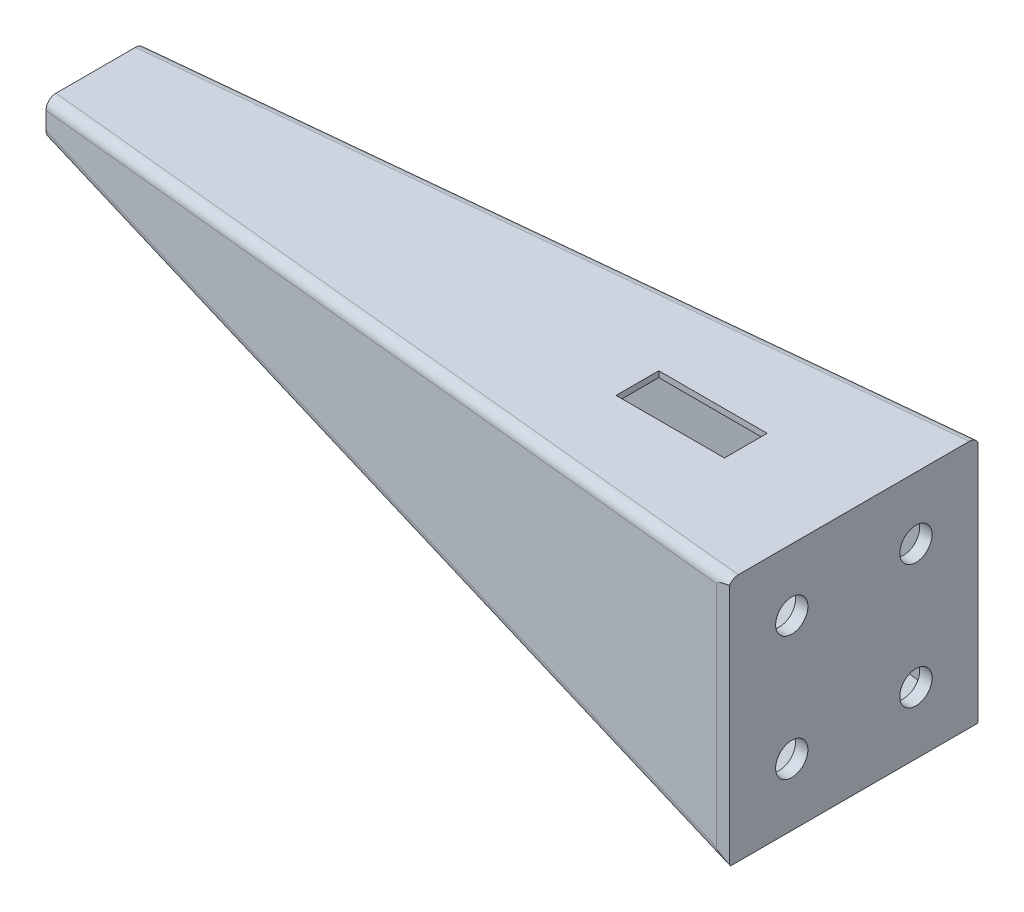
ISO-10303-21;
HEADER;
FILE_DESCRIPTION(('STEP AP214'),'2;1');
FILE_NAME('part.step','',(''),(''),'','','');
FILE_SCHEMA(('AUTOMOTIVE_DESIGN { 1 0 10303 214 1 1 1 1 }'));
ENDSEC;
DATA;
#1=APPLICATION_CONTEXT('core data for automotive mechanical design processes');
#2=APPLICATION_PROTOCOL_DEFINITION('international standard','automotive_design',2000,#1);
#3=PRODUCT_CONTEXT('',#1,'mechanical');
#4=PRODUCT('Part','Part','',(#3));
#5=PRODUCT_RELATED_PRODUCT_CATEGORY('part','',(#4));
#6=PRODUCT_DEFINITION_FORMATION('','',#4);
#7=PRODUCT_DEFINITION_CONTEXT('part definition',#1,'design');
#8=PRODUCT_DEFINITION('design','',#6,#7);
#9=PRODUCT_DEFINITION_SHAPE('','',#8);
#10=(LENGTH_UNIT() NAMED_UNIT(*) SI_UNIT(.MILLI.,.METRE.));
#11=(NAMED_UNIT(*) PLANE_ANGLE_UNIT() SI_UNIT($,.RADIAN.));
#12=(NAMED_UNIT(*) SI_UNIT($,.STERADIAN.) SOLID_ANGLE_UNIT());
#13=UNCERTAINTY_MEASURE_WITH_UNIT(LENGTH_MEASURE(1.E-05),#10,'distance_accuracy_value','');
#14=(GEOMETRIC_REPRESENTATION_CONTEXT(3) GLOBAL_UNCERTAINTY_ASSIGNED_CONTEXT((#13)) GLOBAL_UNIT_ASSIGNED_CONTEXT((#10,
#11,#12)) REPRESENTATION_CONTEXT('',''));
#15=CARTESIAN_POINT('',(0.,0.,0.));
#16=DIRECTION('',(0.,0.,1.));
#17=DIRECTION('',(1.,0.,0.));
#18=AXIS2_PLACEMENT_3D('',#15,#16,#17);
#19=CARTESIAN_POINT('',(-119.833281366305,72.8618846264959,23.8));
#20=DIRECTION('',(-1.,0.,0.));
#21=DIRECTION('',(0.,0.,1.));
#22=AXIS2_PLACEMENT_3D('',#19,#20,#21);
#23=PLANE('',#22);
#24=CARTESIAN_POINT('',(-119.833281366305,-12.5,-12.5));
#25=DIRECTION('',(1.,0.,0.));
#26=DIRECTION('',(0.,0.,-1.));
#27=AXIS2_PLACEMENT_3D('',#24,#25,#26);
#28=CIRCLE('',#27,3.25);
#29=CARTESIAN_POINT('',(-119.833281366305,-12.5,-15.75));
#30=VERTEX_POINT('',#29);
#31=EDGE_CURVE('E398',#30,#30,#28,.T.);
#32=ORIENTED_EDGE('',*,*,#31,.T.);
#33=EDGE_LOOP('',(#32));
#34=FACE_BOUND('',#33,.T.);
#35=CARTESIAN_POINT('',(-119.833281366305,12.5,-12.5));
#36=DIRECTION('',(-1.,0.,0.));
#37=DIRECTION('',(0.,0.,1.));
#38=AXIS2_PLACEMENT_3D('',#35,#36,#37);
#39=CIRCLE('',#38,3.25);
#40=CARTESIAN_POINT('',(-119.833281366305,12.5,-9.25));
#41=VERTEX_POINT('',#40);
#42=EDGE_CURVE('E410',#41,#41,#39,.T.);
#43=ORIENTED_EDGE('',*,*,#42,.F.);
#44=EDGE_LOOP('',(#43));
#45=FACE_BOUND('',#44,.T.);
#46=DIRECTION('',(0.,0.,1.));
#47=VECTOR('',#46,1.);
#48=CARTESIAN_POINT('',(-119.833281366305,23.8,-25.));
#49=LINE('',#48,#47);
#50=CARTESIAN_POINT('',(-119.833281366305,23.8,-23.8));
#51=VERTEX_POINT('',#50);
#52=CARTESIAN_POINT('',(-119.833281366305,23.8,23.8));
#53=VERTEX_POINT('',#52);
#54=EDGE_CURVE('E209',#51,#53,#49,.T.);
#55=ORIENTED_EDGE('',*,*,#54,.F.);
#56=DIRECTION('',(0.,-1.,0.));
#57=VECTOR('',#56,1.);
#58=CARTESIAN_POINT('',(-119.833281366305,72.8618846264959,-23.8));
#59=LINE('',#58,#57);
#60=CARTESIAN_POINT('',(-119.833281366305,-23.8,-23.8));
#61=VERTEX_POINT('',#60);
#62=EDGE_CURVE('E193',#51,#61,#59,.T.);
#63=ORIENTED_EDGE('',*,*,#62,.T.);
#64=DIRECTION('',(0.,0.,-1.));
#65=VECTOR('',#64,1.);
#66=CARTESIAN_POINT('',(-119.833281366305,-23.8,0.));
#67=LINE('',#66,#65);
#68=CARTESIAN_POINT('',(-119.833281366305,-23.8,23.8));
#69=VERTEX_POINT('',#68);
#70=EDGE_CURVE('E189',#69,#61,#67,.T.);
#71=ORIENTED_EDGE('',*,*,#70,.F.);
#72=DIRECTION('',(0.,-1.,0.));
#73=VECTOR('',#72,1.);
#74=CARTESIAN_POINT('',(-119.833281366305,72.8618846264959,23.8));
#75=LINE('',#74,#73);
#76=EDGE_CURVE('E194',#53,#69,#75,.T.);
#77=ORIENTED_EDGE('',*,*,#76,.F.);
#78=EDGE_LOOP('',(#55,#63,#71,#77));
#79=FACE_BOUND('',#78,.T.);
#80=CARTESIAN_POINT('',(-119.833281366305,-12.5,12.5));
#81=DIRECTION('',(-1.,0.,0.));
#82=DIRECTION('',(0.,0.,1.));
#83=AXIS2_PLACEMENT_3D('',#80,#81,#82);
#84=CIRCLE('',#83,3.25);
#85=CARTESIAN_POINT('',(-119.833281366305,-12.5,15.75));
#86=VERTEX_POINT('',#85);
#87=EDGE_CURVE('E413',#86,#86,#84,.T.);
#88=ORIENTED_EDGE('',*,*,#87,.F.);
#89=EDGE_LOOP('',(#88));
#90=FACE_BOUND('',#89,.T.);
#91=CARTESIAN_POINT('',(-119.833281366305,12.5,12.5));
#92=DIRECTION('',(1.,0.,0.));
#93=DIRECTION('',(0.,0.,-1.));
#94=AXIS2_PLACEMENT_3D('',#91,#92,#93);
#95=CIRCLE('',#94,3.25);
#96=CARTESIAN_POINT('',(-119.833281366305,12.5,9.24999999999999));
#97=VERTEX_POINT('',#96);
#98=EDGE_CURVE('E423',#97,#97,#95,.T.);
#99=ORIENTED_EDGE('',*,*,#98,.T.);
#100=EDGE_LOOP('',(#99));
#101=FACE_BOUND('',#100,.T.);
#102=ADVANCED_FACE('F43',(#34,#45,#79,#90,#101),#23,.T.);
#103=CARTESIAN_POINT('',(-117.333281366305,0.,0.));
#104=DIRECTION('',(-1.,0.,0.));
#105=DIRECTION('',(0.,0.,1.));
#106=AXIS2_PLACEMENT_3D('',#103,#104,#105);
#107=PLANE('',#106);
#108=CARTESIAN_POINT('',(-117.333281366305,-12.5,-12.5));
#109=DIRECTION('',(1.,0.,0.));
#110=DIRECTION('',(0.,0.,-1.));
#111=AXIS2_PLACEMENT_3D('',#108,#109,#110);
#112=CIRCLE('',#111,3.25);
#113=CARTESIAN_POINT('',(-117.333281366305,-12.5,-15.75));
#114=VERTEX_POINT('',#113);
#115=EDGE_CURVE('E401',#114,#114,#112,.T.);
#116=ORIENTED_EDGE('',*,*,#115,.F.);
#117=EDGE_LOOP('',(#116));
#118=FACE_BOUND('',#117,.T.);
#119=CARTESIAN_POINT('',(-117.333281366305,12.5,-12.5));
#120=DIRECTION('',(-1.,0.,0.));
#121=DIRECTION('',(0.,0.,1.));
#122=AXIS2_PLACEMENT_3D('',#119,#120,#121);
#123=CIRCLE('',#122,3.25);
#124=CARTESIAN_POINT('',(-117.333281366305,12.5,-9.25));
#125=VERTEX_POINT('',#124);
#126=EDGE_CURVE('E403',#125,#125,#123,.T.);
#127=ORIENTED_EDGE('',*,*,#126,.T.);
#128=EDGE_LOOP('',(#127));
#129=FACE_BOUND('',#128,.T.);
#130=DIRECTION('',(0.,1.,0.));
#131=VECTOR('',#130,1.);
#132=CARTESIAN_POINT('',(-117.333281366305,-25.,-25.));
#133=LINE('',#132,#131);
#134=CARTESIAN_POINT('',(-117.333281366305,-24.7600338851738,-25.));
#135=VERTEX_POINT('',#134);
#136=CARTESIAN_POINT('',(-117.333281366305,23.9954817435175,-25.));
#137=VERTEX_POINT('',#136);
#138=EDGE_CURVE('E504',#135,#137,#133,.T.);
#139=ORIENTED_EDGE('',*,*,#138,.T.);
#140=CARTESIAN_POINT('',(-117.333281366305,23.,-23.2566967391453));
#141=DIRECTION('',(-1.,0.,0.));
#142=DIRECTION('',(0.,0.,-1.));
#143=AXIS2_PLACEMENT_3D('',#140,#141,#142);
#144=ELLIPSE('',#143,2.00997512422418,2.);
#145=CARTESIAN_POINT('',(-117.333281366305,25.,-23.2566967391453));
#146=VERTEX_POINT('',#145);
#147=EDGE_CURVE('E514',#137,#146,#144,.F.);
#148=ORIENTED_EDGE('',*,*,#147,.T.);
#149=DIRECTION('',(0.,0.,1.));
#150=VECTOR('',#149,1.);
#151=CARTESIAN_POINT('',(-117.333281366305,25.,-25.));
#152=LINE('',#151,#150);
#153=CARTESIAN_POINT('',(-117.333281366305,25.,23.2566967391453));
#154=VERTEX_POINT('',#153);
#155=EDGE_CURVE('E517',#146,#154,#152,.T.);
#156=ORIENTED_EDGE('',*,*,#155,.T.);
#157=CARTESIAN_POINT('',(-117.333281366305,23.,23.2566967391453));
#158=DIRECTION('',(-1.,0.,0.));
#159=DIRECTION('',(0.,0.,1.));
#160=AXIS2_PLACEMENT_3D('',#157,#158,#159);
#161=ELLIPSE('',#160,2.00997512422418,2.);
#162=CARTESIAN_POINT('',(-117.333281366305,23.9954817435175,25.));
#163=VERTEX_POINT('',#162);
#164=EDGE_CURVE('E530',#154,#163,#161,.F.);
#165=ORIENTED_EDGE('',*,*,#164,.T.);
#166=DIRECTION('',(0.,-1.,0.));
#167=VECTOR('',#166,1.);
#168=CARTESIAN_POINT('',(-117.333281366305,-25.,25.));
#169=LINE('',#168,#167);
#170=CARTESIAN_POINT('',(-117.333281366305,-24.7600338851739,25.));
#171=VERTEX_POINT('',#170);
#172=EDGE_CURVE('E297',#163,#171,#169,.T.);
#173=ORIENTED_EDGE('',*,*,#172,.T.);
#174=CARTESIAN_POINT('',(-117.333281366305,-23.6768420358577,23.2566967391453));
#175=DIRECTION('',(-1.,0.,0.));
#176=DIRECTION('',(0.,0.942990333582889,-0.332820117735138));
#177=AXIS2_PLACEMENT_3D('',#174,#175,#176);
#178=ELLIPSE('',#177,2.08832734769028,2.);
#179=CARTESIAN_POINT('',(-117.333281366305,-25.,24.8410390213746));
#180=VERTEX_POINT('',#179);
#181=EDGE_CURVE('E535',#171,#180,#178,.F.);
#182=ORIENTED_EDGE('',*,*,#181,.T.);
#183=DIRECTION('',(0.,0.,-1.));
#184=VECTOR('',#183,1.);
#185=CARTESIAN_POINT('',(-117.333281366305,-25.,-25.));
#186=LINE('',#185,#184);
#187=CARTESIAN_POINT('',(-117.333281366305,-25.,-24.8410390213746));
#188=VERTEX_POINT('',#187);
#189=EDGE_CURVE('E518',#180,#188,#186,.T.);
#190=ORIENTED_EDGE('',*,*,#189,.T.);
#191=CARTESIAN_POINT('',(-117.333281366305,-23.6768420358577,-23.2566967391453));
#192=DIRECTION('',(-1.,0.,0.));
#193=DIRECTION('',(0.,0.942990333582889,0.332820117735138));
#194=AXIS2_PLACEMENT_3D('',#191,#192,#193);
#195=ELLIPSE('',#194,2.08832734769028,2.);
#196=EDGE_CURVE('E516',#188,#135,#195,.F.);
#197=ORIENTED_EDGE('',*,*,#196,.T.);
#198=EDGE_LOOP('',(#139,#148,#156,#165,#173,#182,#190,#197));
#199=FACE_BOUND('',#198,.T.);
#200=CARTESIAN_POINT('',(-117.333281366305,-12.5,12.5));
#201=DIRECTION('',(-1.,0.,0.));
#202=DIRECTION('',(0.,0.,1.));
#203=AXIS2_PLACEMENT_3D('',#200,#201,#202);
#204=CIRCLE('',#203,3.25);
#205=CARTESIAN_POINT('',(-117.333281366305,-12.5,15.75));
#206=VERTEX_POINT('',#205);
#207=EDGE_CURVE('E407',#206,#206,#204,.T.);
#208=ORIENTED_EDGE('',*,*,#207,.T.);
#209=EDGE_LOOP('',(#208));
#210=FACE_BOUND('',#209,.T.);
#211=CARTESIAN_POINT('',(-117.333281366305,12.5,12.5));
#212=DIRECTION('',(1.,0.,0.));
#213=DIRECTION('',(0.,0.,-1.));
#214=AXIS2_PLACEMENT_3D('',#211,#212,#213);
#215=CIRCLE('',#214,3.25);
#216=CARTESIAN_POINT('',(-117.333281366305,12.5,9.24999999999999));
#217=VERTEX_POINT('',#216);
#218=EDGE_CURVE('E420',#217,#217,#215,.T.);
#219=ORIENTED_EDGE('',*,*,#218,.F.);
#220=EDGE_LOOP('',(#219));
#221=FACE_BOUND('',#220,.T.);
#222=ADVANCED_FACE('F272',(#118,#129,#199,#210,#221),#107,.F.);
#223=CARTESIAN_POINT('',(-120.,-25.,-23.8));
#224=DIRECTION('',(0.,0.,-1.));
#225=DIRECTION('',(-1.,0.,0.));
#226=AXIS2_PLACEMENT_3D('',#223,#224,#225);
#227=PLANE('',#226);
#228=ORIENTED_EDGE('',*,*,#62,.F.);
#229=DIRECTION('',(1.,0.,0.));
#230=VECTOR('',#229,1.);
#231=CARTESIAN_POINT('',(-120.,23.8,-23.8));
#232=LINE('',#231,#230);
#233=CARTESIAN_POINT('',(-119.940149254655,23.8,-23.8));
#234=VERTEX_POINT('',#233);
#235=EDGE_CURVE('E217',#234,#51,#232,.T.);
#236=ORIENTED_EDGE('',*,*,#235,.F.);
#237=DIRECTION('',(0.,1.,0.));
#238=VECTOR('',#237,1.);
#239=CARTESIAN_POINT('',(-119.940149254655,0.,-23.8));
#240=LINE('',#239,#238);
#241=CARTESIAN_POINT('',(-119.940149254655,-23.7697207649676,-23.8));
#242=VERTEX_POINT('',#241);
#243=EDGE_CURVE('E196',#242,#234,#240,.T.);
#244=ORIENTED_EDGE('',*,*,#243,.F.);
#245=DIRECTION('',(-0.962126726315384,0.272602572456025,0.));
#246=VECTOR('',#245,1.);
#247=CARTESIAN_POINT('',(-15.1472919297666,-53.4610303403526,-23.8));
#248=LINE('',#247,#246);
#249=EDGE_CURVE('E212',#61,#242,#248,.T.);
#250=ORIENTED_EDGE('',*,*,#249,.F.);
#251=EDGE_LOOP('',(#228,#236,#244,#250));
#252=FACE_BOUND('',#251,.T.);
#253=ADVANCED_FACE('F347',(#252),#227,.F.);
#254=CARTESIAN_POINT('',(-15.1472919297666,-53.4610303403526,0.));
#255=DIRECTION('',(0.272602572456025,0.962126726315384,0.));
#256=DIRECTION('',(-0.962126726315384,0.272602572456025,0.));
#257=AXIS2_PLACEMENT_3D('',#254,#255,#256);
#258=PLANE('',#257);
#259=DIRECTION('',(-0.957704261361147,0.271349540718991,-0.0957704261361147));
#260=VECTOR('',#259,1.);
#261=CARTESIAN_POINT('',(-18.2913792835745,-52.5702055901071,33.964876997108));
#262=LINE('',#261,#260);
#263=CARTESIAN_POINT('',(-119.940149254655,-23.7697207649676,23.8));
#264=VERTEX_POINT('',#263);
#265=CARTESIAN_POINT('',(-268.8,18.4072369462135,8.91401492546549));
#266=VERTEX_POINT('',#265);
#267=EDGE_CURVE('E213',#264,#266,#262,.T.);
#268=ORIENTED_EDGE('',*,*,#267,.F.);
#269=DIRECTION('',(-0.962126726315384,0.272602572456025,0.));
#270=VECTOR('',#269,1.);
#271=CARTESIAN_POINT('',(-119.672876913053,-23.8454479284215,23.8));
#272=LINE('',#271,#270);
#273=EDGE_CURVE('E207',#69,#264,#272,.T.);
#274=ORIENTED_EDGE('',*,*,#273,.F.);
#275=ORIENTED_EDGE('',*,*,#70,.T.);
#276=ORIENTED_EDGE('',*,*,#249,.T.);
#277=DIRECTION('',(-0.957704261361147,0.271349540718991,0.0957704261361146));
#278=VECTOR('',#277,1.);
#279=CARTESIAN_POINT('',(-18.2913792835745,-52.5702055901071,-33.964876997108));
#280=LINE('',#279,#278);
#281=CARTESIAN_POINT('',(-268.8,18.4072369462135,-8.91401492546548));
#282=VERTEX_POINT('',#281);
#283=EDGE_CURVE('E461',#242,#282,#280,.T.);
#284=ORIENTED_EDGE('',*,*,#283,.T.);
#285=DIRECTION('',(0.,0.,1.));
#286=VECTOR('',#285,1.);
#287=CARTESIAN_POINT('',(-268.8,18.4072369462135,0.));
#288=LINE('',#287,#286);
#289=EDGE_CURVE('E477',#282,#266,#288,.T.);
#290=ORIENTED_EDGE('',*,*,#289,.T.);
#291=EDGE_LOOP('',(#268,#274,#275,#276,#284,#290));
#292=FACE_BOUND('',#291,.T.);
#293=ADVANCED_FACE('F211',(#292),#258,.T.);
#294=CARTESIAN_POINT('',(-3.54396187380846,0.,-35.4396187380846));
#295=DIRECTION('',(0.0995037190209989,0.,0.995037190209989));
#296=DIRECTION('',(0.995037190209989,0.,-0.0995037190209989));
#297=AXIS2_PLACEMENT_3D('',#294,#295,#296);
#298=PLANE('',#297);
#299=ORIENTED_EDGE('',*,*,#283,.F.);
#300=ORIENTED_EDGE('',*,*,#243,.T.);
#301=DIRECTION('',(-0.995037190209989,0.,0.0995037190209989));
#302=VECTOR('',#301,1.);
#303=CARTESIAN_POINT('',(-3.54396187380846,23.8,-35.4396187380846));
#304=LINE('',#303,#302);
#305=CARTESIAN_POINT('',(-268.8,23.8,-8.91401492546548));
#306=VERTEX_POINT('',#305);
#307=EDGE_CURVE('E462',#234,#306,#304,.T.);
#308=ORIENTED_EDGE('',*,*,#307,.T.);
#309=DIRECTION('',(0.,-1.,0.));
#310=VECTOR('',#309,1.);
#311=CARTESIAN_POINT('',(-268.8,0.,-8.91401492546549));
#312=LINE('',#311,#310);
#313=EDGE_CURVE('E225',#306,#282,#312,.T.);
#314=ORIENTED_EDGE('',*,*,#313,.T.);
#315=EDGE_LOOP('',(#299,#300,#308,#314));
#316=FACE_BOUND('',#315,.T.);
#317=ADVANCED_FACE('F342',(#316),#298,.T.);
#318=CARTESIAN_POINT('',(-268.8,0.,0.));
#319=DIRECTION('',(1.,0.,0.));
#320=DIRECTION('',(0.,0.,-1.));
#321=AXIS2_PLACEMENT_3D('',#318,#319,#320);
#322=PLANE('',#321);
#323=DIRECTION('',(0.,1.,0.));
#324=VECTOR('',#323,1.);
#325=CARTESIAN_POINT('',(-268.8,0.,8.91401492546549));
#326=LINE('',#325,#324);
#327=CARTESIAN_POINT('',(-268.8,23.8,8.91401492546549));
#328=VERTEX_POINT('',#327);
#329=EDGE_CURVE('E456',#266,#328,#326,.T.);
#330=ORIENTED_EDGE('',*,*,#329,.F.);
#331=ORIENTED_EDGE('',*,*,#289,.F.);
#332=ORIENTED_EDGE('',*,*,#313,.F.);
#333=DIRECTION('',(0.,0.,-1.));
#334=VECTOR('',#333,1.);
#335=CARTESIAN_POINT('',(-268.8,23.8,-25.));
#336=LINE('',#335,#334);
#337=EDGE_CURVE('E463',#328,#306,#336,.T.);
#338=ORIENTED_EDGE('',*,*,#337,.F.);
#339=EDGE_LOOP('',(#330,#331,#332,#338));
#340=FACE_BOUND('',#339,.T.);
#341=ADVANCED_FACE('F344',(#340),#322,.T.);
#342=CARTESIAN_POINT('',(-3.54396187380847,0.,35.4396187380847));
#343=DIRECTION('',(0.0995037190209989,0.,-0.995037190209989));
#344=DIRECTION('',(-0.995037190209989,0.,-0.0995037190209989));
#345=AXIS2_PLACEMENT_3D('',#342,#343,#344);
#346=PLANE('',#345);
#347=DIRECTION('',(-0.995037190209989,0.,-0.0995037190209989));
#348=VECTOR('',#347,1.);
#349=CARTESIAN_POINT('',(-124.83109058668,23.8,23.3109058667975));
#350=LINE('',#349,#348);
#351=CARTESIAN_POINT('',(-119.940149254655,23.8,23.8));
#352=VERTEX_POINT('',#351);
#353=EDGE_CURVE('E466',#352,#328,#350,.T.);
#354=ORIENTED_EDGE('',*,*,#353,.F.);
#355=DIRECTION('',(0.,-1.,0.));
#356=VECTOR('',#355,1.);
#357=CARTESIAN_POINT('',(-119.940149254655,0.,23.8));
#358=LINE('',#357,#356);
#359=EDGE_CURVE('E198',#352,#264,#358,.T.);
#360=ORIENTED_EDGE('',*,*,#359,.T.);
#361=ORIENTED_EDGE('',*,*,#267,.T.);
#362=ORIENTED_EDGE('',*,*,#329,.T.);
#363=EDGE_LOOP('',(#354,#360,#361,#362));
#364=FACE_BOUND('',#363,.T.);
#365=ADVANCED_FACE('F333',(#364),#346,.T.);
#366=CARTESIAN_POINT('',(-120.,-25.,23.8));
#367=DIRECTION('',(0.,0.,1.));
#368=DIRECTION('',(1.,0.,0.));
#369=AXIS2_PLACEMENT_3D('',#366,#367,#368);
#370=PLANE('',#369);
#371=DIRECTION('',(1.,0.,0.));
#372=VECTOR('',#371,1.);
#373=CARTESIAN_POINT('',(-120.,23.8,23.8));
#374=LINE('',#373,#372);
#375=EDGE_CURVE('E206',#352,#53,#374,.T.);
#376=ORIENTED_EDGE('',*,*,#375,.T.);
#377=ORIENTED_EDGE('',*,*,#76,.T.);
#378=ORIENTED_EDGE('',*,*,#273,.T.);
#379=ORIENTED_EDGE('',*,*,#359,.F.);
#380=EDGE_LOOP('',(#376,#377,#378,#379));
#381=FACE_BOUND('',#380,.T.);
#382=ADVANCED_FACE('F203',(#381),#370,.F.);
#383=CARTESIAN_POINT('',(-120.,23.8,-25.));
#384=DIRECTION('',(0.,1.,0.));
#385=DIRECTION('',(0.,0.,1.));
#386=AXIS2_PLACEMENT_3D('',#383,#384,#385);
#387=PLANE('',#386);
#388=DIRECTION('',(-1.,0.,0.));
#389=VECTOR('',#388,1.);
#390=CARTESIAN_POINT('',(-120.,23.8,-4.3));
#391=LINE('',#390,#389);
#392=CARTESIAN_POINT('',(-139.09,23.8,-4.3));
#393=VERTEX_POINT('',#392);
#394=CARTESIAN_POINT('',(-160.91,23.8,-4.3));
#395=VERTEX_POINT('',#394);
#396=EDGE_CURVE('E453',#393,#395,#391,.T.);
#397=ORIENTED_EDGE('',*,*,#396,.T.);
#398=DIRECTION('',(0.,0.,1.));
#399=VECTOR('',#398,1.);
#400=CARTESIAN_POINT('',(-160.91,23.8,-25.));
#401=LINE('',#400,#399);
#402=CARTESIAN_POINT('',(-160.91,23.8,4.3));
#403=VERTEX_POINT('',#402);
#404=EDGE_CURVE('E460',#395,#403,#401,.T.);
#405=ORIENTED_EDGE('',*,*,#404,.T.);
#406=DIRECTION('',(1.,0.,0.));
#407=VECTOR('',#406,1.);
#408=CARTESIAN_POINT('',(-120.,23.8,4.3));
#409=LINE('',#408,#407);
#410=CARTESIAN_POINT('',(-139.09,23.8,4.3));
#411=VERTEX_POINT('',#410);
#412=EDGE_CURVE('E449',#403,#411,#409,.T.);
#413=ORIENTED_EDGE('',*,*,#412,.T.);
#414=DIRECTION('',(0.,0.,-1.));
#415=VECTOR('',#414,1.);
#416=CARTESIAN_POINT('',(-139.09,23.8,-25.));
#417=LINE('',#416,#415);
#418=EDGE_CURVE('E454',#411,#393,#417,.T.);
#419=ORIENTED_EDGE('',*,*,#418,.T.);
#420=EDGE_LOOP('',(#397,#405,#413,#419));
#421=FACE_BOUND('',#420,.T.);
#422=ORIENTED_EDGE('',*,*,#235,.T.);
#423=ORIENTED_EDGE('',*,*,#54,.T.);
#424=ORIENTED_EDGE('',*,*,#375,.F.);
#425=ORIENTED_EDGE('',*,*,#353,.T.);
#426=ORIENTED_EDGE('',*,*,#337,.T.);
#427=ORIENTED_EDGE('',*,*,#307,.F.);
#428=EDGE_LOOP('',(#422,#423,#424,#425,#426,#427));
#429=FACE_BOUND('',#428,.T.);
#430=ADVANCED_FACE('F266',(#421,#429),#387,.F.);
#431=CARTESIAN_POINT('',(-120.,25.,-25.));
#432=DIRECTION('',(0.,1.,0.));
#433=DIRECTION('',(0.,0.,1.));
#434=AXIS2_PLACEMENT_3D('',#431,#432,#433);
#435=PLANE('',#434);
#436=ORIENTED_EDGE('',*,*,#155,.F.);
#437=DIRECTION('',(-0.995037190209989,0.,0.0995037190209989));
#438=VECTOR('',#437,1.);
#439=CARTESIAN_POINT('',(-269.800992561958,25.,-8.00992561958003));
#440=LINE('',#439,#438);
#441=CARTESIAN_POINT('',(-270.,25.,-7.99002487577582));
#442=VERTEX_POINT('',#441);
#443=EDGE_CURVE('E299',#146,#442,#440,.T.);
#444=ORIENTED_EDGE('',*,*,#443,.T.);
#445=DIRECTION('',(0.,0.,-1.));
#446=VECTOR('',#445,1.);
#447=CARTESIAN_POINT('',(-270.,25.,-10.));
#448=LINE('',#447,#446);
#449=CARTESIAN_POINT('',(-270.,25.,7.99002487577583));
#450=VERTEX_POINT('',#449);
#451=EDGE_CURVE('E295',#450,#442,#448,.T.);
#452=ORIENTED_EDGE('',*,*,#451,.F.);
#453=DIRECTION('',(-0.995037190209989,0.,-0.0995037190209989));
#454=VECTOR('',#453,1.);
#455=CARTESIAN_POINT('',(-119.800992561958,25.,23.00992561958));
#456=LINE('',#455,#454);
#457=EDGE_CURVE('E300',#450,#154,#456,.F.);
#458=ORIENTED_EDGE('',*,*,#457,.T.);
#459=EDGE_LOOP('',(#436,#444,#452,#458));
#460=FACE_BOUND('',#459,.T.);
#461=DIRECTION('',(0.,0.,1.));
#462=VECTOR('',#461,1.);
#463=CARTESIAN_POINT('',(-160.91,25.,-4.3));
#464=LINE('',#463,#462);
#465=CARTESIAN_POINT('',(-160.91,25.,-4.3));
#466=VERTEX_POINT('',#465);
#467=CARTESIAN_POINT('',(-160.91,25.,4.3));
#468=VERTEX_POINT('',#467);
#469=EDGE_CURVE('E447',#466,#468,#464,.T.);
#470=ORIENTED_EDGE('',*,*,#469,.F.);
#471=DIRECTION('',(-1.,0.,0.));
#472=VECTOR('',#471,1.);
#473=CARTESIAN_POINT('',(-139.09,25.,-4.3));
#474=LINE('',#473,#472);
#475=CARTESIAN_POINT('',(-139.09,25.,-4.3));
#476=VERTEX_POINT('',#475);
#477=EDGE_CURVE('E435',#476,#466,#474,.T.);
#478=ORIENTED_EDGE('',*,*,#477,.F.);
#479=DIRECTION('',(0.,0.,-1.));
#480=VECTOR('',#479,1.);
#481=CARTESIAN_POINT('',(-139.09,25.,-4.3));
#482=LINE('',#481,#480);
#483=CARTESIAN_POINT('',(-139.09,25.,4.3));
#484=VERTEX_POINT('',#483);
#485=EDGE_CURVE('E439',#484,#476,#482,.T.);
#486=ORIENTED_EDGE('',*,*,#485,.F.);
#487=DIRECTION('',(1.,0.,0.));
#488=VECTOR('',#487,1.);
#489=CARTESIAN_POINT('',(-139.09,25.,4.3));
#490=LINE('',#489,#488);
#491=EDGE_CURVE('E442',#468,#484,#490,.T.);
#492=ORIENTED_EDGE('',*,*,#491,.F.);
#493=EDGE_LOOP('',(#470,#478,#486,#492));
#494=FACE_BOUND('',#493,.T.);
#495=ADVANCED_FACE('F256',(#460,#494),#435,.T.);
#496=CARTESIAN_POINT('',(-120.,-25.,-25.));
#497=DIRECTION('',(0.,0.,-1.));
#498=DIRECTION('',(-1.,0.,0.));
#499=AXIS2_PLACEMENT_3D('',#496,#497,#498);
#500=PLANE('',#499);
#501=DIRECTION('',(0.,1.,0.));
#502=VECTOR('',#501,1.);
#503=CARTESIAN_POINT('',(-120.,-25.,-25.));
#504=LINE('',#503,#502);
#505=CARTESIAN_POINT('',(-120.,-22.9776571970894,-25.));
#506=VERTEX_POINT('',#505);
#507=CARTESIAN_POINT('',(-120.,23.,-25.));
#508=VERTEX_POINT('',#507);
#509=EDGE_CURVE('E553',#506,#508,#504,.T.);
#510=ORIENTED_EDGE('',*,*,#509,.T.);
#511=CARTESIAN_POINT('',(-99.9002487577583,23.,-25.));
#512=DIRECTION('',(0.,0.,-1.));
#513=DIRECTION('',(1.,0.,0.));
#514=AXIS2_PLACEMENT_3D('',#511,#512,#513);
#515=ELLIPSE('',#514,20.0997512422418,2.);
#516=EDGE_CURVE('E527',#508,#137,#515,.T.);
#517=ORIENTED_EDGE('',*,*,#516,.T.);
#518=ORIENTED_EDGE('',*,*,#138,.F.);
#519=CARTESIAN_POINT('',(-99.9002487577582,-28.616201274946,-25.));
#520=DIRECTION('',(0.,0.,-1.));
#521=DIRECTION('',(-0.962126726315384,0.272602572456025,0.));
#522=AXIS2_PLACEMENT_3D('',#519,#520,#521);
#523=ELLIPSE('',#522,20.8832734769028,2.);
#524=EDGE_CURVE('E601',#135,#506,#523,.T.);
#525=ORIENTED_EDGE('',*,*,#524,.T.);
#526=EDGE_LOOP('',(#510,#517,#518,#525));
#527=FACE_BOUND('',#526,.T.);
#528=ADVANCED_FACE('F254',(#527),#500,.T.);
#529=CARTESIAN_POINT('',(-120.,-25.,-25.));
#530=DIRECTION('',(0.,-1.,0.));
#531=DIRECTION('',(0.,0.,-1.));
#532=AXIS2_PLACEMENT_3D('',#529,#530,#531);
#533=PLANE('',#532);
#534=ORIENTED_EDGE('',*,*,#189,.F.);
#535=CARTESIAN_POINT('',(-112.663312081097,-25.,23.7236936676661));
#536=DIRECTION('',(0.,-1.,0.));
#537=DIRECTION('',(-0.995037190209989,0.,-0.0995037190209989));
#538=AXIS2_PLACEMENT_3D('',#535,#536,#537);
#539=ELLIPSE('',#538,7.3705671094951,2.);
#540=CARTESIAN_POINT('',(-120.,-25.,23.044545390267));
#541=VERTEX_POINT('',#540);
#542=EDGE_CURVE('E11',#180,#541,#539,.T.);
#543=ORIENTED_EDGE('',*,*,#542,.T.);
#544=DIRECTION('',(0.,0.,-1.));
#545=VECTOR('',#544,1.);
#546=CARTESIAN_POINT('',(-120.,-25.,-25.));
#547=LINE('',#546,#545);
#548=CARTESIAN_POINT('',(-120.,-25.,-23.044545390267));
#549=VERTEX_POINT('',#548);
#550=EDGE_CURVE('E540',#541,#549,#547,.T.);
#551=ORIENTED_EDGE('',*,*,#550,.T.);
#552=CARTESIAN_POINT('',(-112.663312081097,-25.,-23.7236936676661));
#553=DIRECTION('',(0.,-1.,0.));
#554=DIRECTION('',(-0.995037190209989,0.,0.0995037190209989));
#555=AXIS2_PLACEMENT_3D('',#552,#553,#554);
#556=ELLIPSE('',#555,7.3705671094951,2.);
#557=EDGE_CURVE('E52',#549,#188,#556,.T.);
#558=ORIENTED_EDGE('',*,*,#557,.T.);
#559=EDGE_LOOP('',(#534,#543,#551,#558));
#560=FACE_BOUND('',#559,.T.);
#561=ADVANCED_FACE('F259',(#560),#533,.T.);
#562=CARTESIAN_POINT('',(-120.,-25.,25.));
#563=DIRECTION('',(0.,0.,1.));
#564=DIRECTION('',(1.,0.,0.));
#565=AXIS2_PLACEMENT_3D('',#562,#563,#564);
#566=PLANE('',#565);
#567=ORIENTED_EDGE('',*,*,#172,.F.);
#568=CARTESIAN_POINT('',(-99.9002487577583,23.,25.));
#569=DIRECTION('',(0.,0.,1.));
#570=DIRECTION('',(1.,0.,0.));
#571=AXIS2_PLACEMENT_3D('',#568,#569,#570);
#572=ELLIPSE('',#571,20.0997512422418,2.);
#573=CARTESIAN_POINT('',(-120.,23.,25.));
#574=VERTEX_POINT('',#573);
#575=EDGE_CURVE('E549',#163,#574,#572,.T.);
#576=ORIENTED_EDGE('',*,*,#575,.T.);
#577=DIRECTION('',(0.,-1.,0.));
#578=VECTOR('',#577,1.);
#579=CARTESIAN_POINT('',(-120.,-25.,25.));
#580=LINE('',#579,#578);
#581=CARTESIAN_POINT('',(-120.,-22.9776571970894,25.));
#582=VERTEX_POINT('',#581);
#583=EDGE_CURVE('E539',#574,#582,#580,.T.);
#584=ORIENTED_EDGE('',*,*,#583,.T.);
#585=CARTESIAN_POINT('',(-99.9002487577583,-28.616201274946,25.));
#586=DIRECTION('',(0.,0.,1.));
#587=DIRECTION('',(-0.962126726315384,0.272602572456025,0.));
#588=AXIS2_PLACEMENT_3D('',#585,#586,#587);
#589=ELLIPSE('',#588,20.8832734769028,2.);
#590=EDGE_CURVE('E544',#582,#171,#589,.T.);
#591=ORIENTED_EDGE('',*,*,#590,.T.);
#592=EDGE_LOOP('',(#567,#576,#584,#591));
#593=FACE_BOUND('',#592,.T.);
#594=ADVANCED_FACE('F262',(#593),#566,.T.);
#595=CARTESIAN_POINT('',(-270.,0.,0.));
#596=DIRECTION('',(1.,0.,0.));
#597=DIRECTION('',(0.,0.,-1.));
#598=AXIS2_PLACEMENT_3D('',#595,#596,#597);
#599=PLANE('',#598);
#600=ORIENTED_EDGE('',*,*,#451,.T.);
#601=CARTESIAN_POINT('',(-270.,23.,-7.99002487577583));
#602=DIRECTION('',(1.,0.,0.));
#603=DIRECTION('',(0.,0.,-1.));
#604=AXIS2_PLACEMENT_3D('',#601,#602,#603);
#605=ELLIPSE('',#604,2.00997512422418,2.);
#606=CARTESIAN_POINT('',(-270.,23.,-10.));
#607=VERTEX_POINT('',#606);
#608=EDGE_CURVE('E590',#442,#607,#605,.F.);
#609=ORIENTED_EDGE('',*,*,#608,.T.);
#610=DIRECTION('',(0.,-1.,0.));
#611=VECTOR('',#610,1.);
#612=CARTESIAN_POINT('',(-270.,17.5,-10.));
#613=LINE('',#612,#611);
#614=CARTESIAN_POINT('',(-270.,19.5223428029106,-10.));
#615=VERTEX_POINT('',#614);
#616=EDGE_CURVE('E319',#607,#615,#613,.T.);
#617=ORIENTED_EDGE('',*,*,#616,.T.);
#618=CARTESIAN_POINT('',(-270.,19.5787282436892,-7.99002487577582));
#619=DIRECTION('',(1.,0.,0.));
#620=DIRECTION('',(0.,0.942990333582889,0.332820117735138));
#621=AXIS2_PLACEMENT_3D('',#618,#619,#620);
#622=ELLIPSE('',#621,2.08832734769028,2.);
#623=CARTESIAN_POINT('',(-270.,17.5,-8.04454539026703));
#624=VERTEX_POINT('',#623);
#625=EDGE_CURVE('E302',#615,#624,#622,.F.);
#626=ORIENTED_EDGE('',*,*,#625,.T.);
#627=DIRECTION('',(0.,0.,1.));
#628=VECTOR('',#627,1.);
#629=CARTESIAN_POINT('',(-270.,17.5,-10.));
#630=LINE('',#629,#628);
#631=CARTESIAN_POINT('',(-270.,17.5,8.04454539026703));
#632=VERTEX_POINT('',#631);
#633=EDGE_CURVE('E50',#624,#632,#630,.T.);
#634=ORIENTED_EDGE('',*,*,#633,.T.);
#635=CARTESIAN_POINT('',(-270.,19.5787282436892,7.99002487577583));
#636=DIRECTION('',(1.,0.,0.));
#637=DIRECTION('',(0.,0.942990333582889,-0.332820117735138));
#638=AXIS2_PLACEMENT_3D('',#635,#636,#637);
#639=ELLIPSE('',#638,2.08832734769028,2.);
#640=CARTESIAN_POINT('',(-270.,19.5223428029106,10.));
#641=VERTEX_POINT('',#640);
#642=EDGE_CURVE('E580',#632,#641,#639,.F.);
#643=ORIENTED_EDGE('',*,*,#642,.T.);
#644=DIRECTION('',(0.,1.,0.));
#645=VECTOR('',#644,1.);
#646=CARTESIAN_POINT('',(-270.,17.5,10.));
#647=LINE('',#646,#645);
#648=CARTESIAN_POINT('',(-270.,23.,10.));
#649=VERTEX_POINT('',#648);
#650=EDGE_CURVE('E219',#641,#649,#647,.T.);
#651=ORIENTED_EDGE('',*,*,#650,.T.);
#652=CARTESIAN_POINT('',(-270.,23.,7.99002487577583));
#653=DIRECTION('',(1.,0.,0.));
#654=DIRECTION('',(0.,0.,1.));
#655=AXIS2_PLACEMENT_3D('',#652,#653,#654);
#656=ELLIPSE('',#655,2.00997512422418,2.);
#657=EDGE_CURVE('E585',#649,#450,#656,.F.);
#658=ORIENTED_EDGE('',*,*,#657,.T.);
#659=EDGE_LOOP('',(#600,#609,#617,#626,#634,#643,#651,#658));
#660=FACE_BOUND('',#659,.T.);
#661=ADVANCED_FACE('F261',(#660),#599,.F.);
#662=CARTESIAN_POINT('',(-3.66336633663366,0.,-36.6336633663366));
#663=DIRECTION('',(0.0995037190209989,0.,0.995037190209989));
#664=DIRECTION('',(0.995037190209989,0.,-0.0995037190209989));
#665=AXIS2_PLACEMENT_3D('',#662,#663,#664);
#666=PLANE('',#665);
#667=ORIENTED_EDGE('',*,*,#616,.F.);
#668=DIRECTION('',(-0.995037190209989,0.,0.0995037190209989));
#669=VECTOR('',#668,1.);
#670=CARTESIAN_POINT('',(-120.,23.,-25.));
#671=LINE('',#670,#669);
#672=EDGE_CURVE('E596',#607,#508,#671,.F.);
#673=ORIENTED_EDGE('',*,*,#672,.T.);
#674=ORIENTED_EDGE('',*,*,#509,.F.);
#675=DIRECTION('',(-0.957704261361147,0.271349540718991,0.0957704261361147));
#676=VECTOR('',#675,1.);
#677=CARTESIAN_POINT('',(-18.2005631442118,-51.8208309728961,-35.1799436855788));
#678=LINE('',#677,#676);
#679=EDGE_CURVE('E592',#506,#615,#678,.T.);
#680=ORIENTED_EDGE('',*,*,#679,.T.);
#681=EDGE_LOOP('',(#667,#673,#674,#680));
#682=FACE_BOUND('',#681,.T.);
#683=ADVANCED_FACE('F244',(#682),#666,.F.);
#684=CARTESIAN_POINT('',(-15.4744150167138,-54.6155824119311,0.));
#685=DIRECTION('',(0.272602572456025,0.962126726315384,0.));
#686=DIRECTION('',(-0.962126726315384,0.272602572456025,0.));
#687=AXIS2_PLACEMENT_3D('',#684,#685,#686);
#688=PLANE('',#687);
#689=ORIENTED_EDGE('',*,*,#550,.F.);
#690=DIRECTION('',(-0.957704261361147,0.271349540718992,-0.0957704261361147));
#691=VECTOR('',#690,1.);
#692=CARTESIAN_POINT('',(-18.5467608510818,-53.7450844255268,33.1898693051589));
#693=LINE('',#692,#691);
#694=EDGE_CURVE('E567',#541,#632,#693,.T.);
#695=ORIENTED_EDGE('',*,*,#694,.T.);
#696=ORIENTED_EDGE('',*,*,#633,.F.);
#697=DIRECTION('',(-0.957704261361147,0.271349540718992,0.0957704261361147));
#698=VECTOR('',#697,1.);
#699=CARTESIAN_POINT('',(-18.5467608510818,-53.7450844255268,-33.1898693051588));
#700=LINE('',#699,#698);
#701=EDGE_CURVE('E64',#624,#549,#700,.F.);
#702=ORIENTED_EDGE('',*,*,#701,.T.);
#703=EDGE_LOOP('',(#689,#695,#696,#702));
#704=FACE_BOUND('',#703,.T.);
#705=ADVANCED_FACE('F232',(#704),#688,.F.);
#706=CARTESIAN_POINT('',(-3.66336633663366,0.,36.6336633663366));
#707=DIRECTION('',(0.0995037190209989,0.,-0.995037190209989));
#708=DIRECTION('',(-0.995037190209989,0.,-0.0995037190209989));
#709=AXIS2_PLACEMENT_3D('',#706,#707,#708);
#710=PLANE('',#709);
#711=ORIENTED_EDGE('',*,*,#583,.F.);
#712=DIRECTION('',(-0.995037190209989,0.,-0.0995037190209989));
#713=VECTOR('',#712,1.);
#714=CARTESIAN_POINT('',(-270.,23.,10.));
#715=LINE('',#714,#713);
#716=EDGE_CURVE('E528',#574,#649,#715,.T.);
#717=ORIENTED_EDGE('',*,*,#716,.T.);
#718=ORIENTED_EDGE('',*,*,#650,.F.);
#719=DIRECTION('',(-0.957704261361147,0.271349540718991,-0.0957704261361147));
#720=VECTOR('',#719,1.);
#721=CARTESIAN_POINT('',(-18.2005631442118,-51.8208309728961,35.1799436855788));
#722=LINE('',#721,#720);
#723=EDGE_CURVE('E529',#641,#582,#722,.F.);
#724=ORIENTED_EDGE('',*,*,#723,.T.);
#725=EDGE_LOOP('',(#711,#717,#718,#724));
#726=FACE_BOUND('',#725,.T.);
#727=ADVANCED_FACE('F242',(#726),#710,.F.);
#728=CARTESIAN_POINT('',(-160.91,21.,-4.3));
#729=DIRECTION('',(-1.,0.,0.));
#730=DIRECTION('',(0.,0.,1.));
#731=AXIS2_PLACEMENT_3D('',#728,#729,#730);
#732=PLANE('',#731);
#733=DIRECTION('',(0.,1.,0.));
#734=VECTOR('',#733,1.);
#735=CARTESIAN_POINT('',(-160.91,21.,-4.3));
#736=LINE('',#735,#734);
#737=EDGE_CURVE('E426',#395,#466,#736,.T.);
#738=ORIENTED_EDGE('',*,*,#737,.T.);
#739=ORIENTED_EDGE('',*,*,#469,.T.);
#740=DIRECTION('',(0.,1.,0.));
#741=VECTOR('',#740,1.);
#742=CARTESIAN_POINT('',(-160.91,21.,4.3));
#743=LINE('',#742,#741);
#744=EDGE_CURVE('E429',#403,#468,#743,.T.);
#745=ORIENTED_EDGE('',*,*,#744,.F.);
#746=ORIENTED_EDGE('',*,*,#404,.F.);
#747=EDGE_LOOP('',(#738,#739,#745,#746));
#748=FACE_BOUND('',#747,.T.);
#749=ADVANCED_FACE('F252',(#748),#732,.F.);
#750=CARTESIAN_POINT('',(-139.09,21.,-4.3));
#751=DIRECTION('',(0.,0.,-1.));
#752=DIRECTION('',(-1.,0.,0.));
#753=AXIS2_PLACEMENT_3D('',#750,#751,#752);
#754=PLANE('',#753);
#755=DIRECTION('',(0.,1.,0.));
#756=VECTOR('',#755,1.);
#757=CARTESIAN_POINT('',(-139.09,21.,-4.3));
#758=LINE('',#757,#756);
#759=EDGE_CURVE('E434',#393,#476,#758,.T.);
#760=ORIENTED_EDGE('',*,*,#759,.T.);
#761=ORIENTED_EDGE('',*,*,#477,.T.);
#762=ORIENTED_EDGE('',*,*,#737,.F.);
#763=ORIENTED_EDGE('',*,*,#396,.F.);
#764=EDGE_LOOP('',(#760,#761,#762,#763));
#765=FACE_BOUND('',#764,.T.);
#766=ADVANCED_FACE('F365',(#765),#754,.F.);
#767=CARTESIAN_POINT('',(-139.09,21.,-4.3));
#768=DIRECTION('',(1.,0.,0.));
#769=DIRECTION('',(0.,0.,-1.));
#770=AXIS2_PLACEMENT_3D('',#767,#768,#769);
#771=PLANE('',#770);
#772=DIRECTION('',(0.,1.,0.));
#773=VECTOR('',#772,1.);
#774=CARTESIAN_POINT('',(-139.09,21.,4.3));
#775=LINE('',#774,#773);
#776=EDGE_CURVE('E433',#411,#484,#775,.T.);
#777=ORIENTED_EDGE('',*,*,#776,.T.);
#778=ORIENTED_EDGE('',*,*,#485,.T.);
#779=ORIENTED_EDGE('',*,*,#759,.F.);
#780=ORIENTED_EDGE('',*,*,#418,.F.);
#781=EDGE_LOOP('',(#777,#778,#779,#780));
#782=FACE_BOUND('',#781,.T.);
#783=ADVANCED_FACE('F362',(#782),#771,.F.);
#784=CARTESIAN_POINT('',(-139.09,21.,4.3));
#785=DIRECTION('',(0.,0.,1.));
#786=DIRECTION('',(1.,0.,0.));
#787=AXIS2_PLACEMENT_3D('',#784,#785,#786);
#788=PLANE('',#787);
#789=ORIENTED_EDGE('',*,*,#744,.T.);
#790=ORIENTED_EDGE('',*,*,#491,.T.);
#791=ORIENTED_EDGE('',*,*,#776,.F.);
#792=ORIENTED_EDGE('',*,*,#412,.F.);
#793=EDGE_LOOP('',(#789,#790,#791,#792));
#794=FACE_BOUND('',#793,.T.);
#795=ADVANCED_FACE('F367',(#794),#788,.F.);
#796=CARTESIAN_POINT('',(-119.833281366305,12.5,-12.5));
#797=DIRECTION('',(1.,0.,0.));
#798=DIRECTION('',(0.,0.,-1.));
#799=AXIS2_PLACEMENT_3D('',#796,#797,#798);
#800=CYLINDRICAL_SURFACE('',#799,3.25);
#801=ORIENTED_EDGE('',*,*,#42,.T.);
#802=EDGE_LOOP('',(#801));
#803=FACE_BOUND('',#802,.T.);
#804=ORIENTED_EDGE('',*,*,#126,.F.);
#805=EDGE_LOOP('',(#804));
#806=FACE_BOUND('',#805,.T.);
#807=ADVANCED_FACE('F363',(#803,#806),#800,.F.);
#808=CARTESIAN_POINT('',(-119.833281366305,-12.5,-12.5));
#809=DIRECTION('',(1.,0.,0.));
#810=DIRECTION('',(0.,0.,-1.));
#811=AXIS2_PLACEMENT_3D('',#808,#809,#810);
#812=CYLINDRICAL_SURFACE('',#811,3.25);
#813=ORIENTED_EDGE('',*,*,#31,.F.);
#814=EDGE_LOOP('',(#813));
#815=FACE_BOUND('',#814,.T.);
#816=ORIENTED_EDGE('',*,*,#115,.T.);
#817=EDGE_LOOP('',(#816));
#818=FACE_BOUND('',#817,.T.);
#819=ADVANCED_FACE('F385',(#815,#818),#812,.F.);
#820=CARTESIAN_POINT('',(-119.833281366305,-12.5,12.5));
#821=DIRECTION('',(1.,0.,0.));
#822=DIRECTION('',(0.,0.,-1.));
#823=AXIS2_PLACEMENT_3D('',#820,#821,#822);
#824=CYLINDRICAL_SURFACE('',#823,3.25);
#825=ORIENTED_EDGE('',*,*,#87,.T.);
#826=EDGE_LOOP('',(#825));
#827=FACE_BOUND('',#826,.T.);
#828=ORIENTED_EDGE('',*,*,#207,.F.);
#829=EDGE_LOOP('',(#828));
#830=FACE_BOUND('',#829,.T.);
#831=ADVANCED_FACE('F390',(#827,#830),#824,.F.);
#832=CARTESIAN_POINT('',(-119.833281366305,12.5,12.5));
#833=DIRECTION('',(1.,0.,0.));
#834=DIRECTION('',(0.,0.,-1.));
#835=AXIS2_PLACEMENT_3D('',#832,#833,#834);
#836=CYLINDRICAL_SURFACE('',#835,3.25);
#837=ORIENTED_EDGE('',*,*,#98,.F.);
#838=EDGE_LOOP('',(#837));
#839=FACE_BOUND('',#838,.T.);
#840=ORIENTED_EDGE('',*,*,#218,.T.);
#841=EDGE_LOOP('',(#840));
#842=FACE_BOUND('',#841,.T.);
#843=ADVANCED_FACE('F381',(#839,#842),#836,.F.);
#844=CARTESIAN_POINT('',(-119.800992561958,23.,-23.00992561958));
#845=DIRECTION('',(0.995037190209989,0.,-0.0995037190209989));
#846=DIRECTION('',(-0.0995037190209989,0.,-0.995037190209989));
#847=AXIS2_PLACEMENT_3D('',#844,#845,#846);
#848=CYLINDRICAL_SURFACE('',#847,2.);
#849=ORIENTED_EDGE('',*,*,#516,.F.);
#850=ORIENTED_EDGE('',*,*,#672,.F.);
#851=ORIENTED_EDGE('',*,*,#608,.F.);
#852=ORIENTED_EDGE('',*,*,#443,.F.);
#853=ORIENTED_EDGE('',*,*,#147,.F.);
#854=EDGE_LOOP('',(#849,#850,#851,#852,#853));
#855=FACE_BOUND('',#854,.T.);
#856=ADVANCED_FACE('F386',(#855),#848,.T.);
#857=CARTESIAN_POINT('',(-3.46435889859167,23.,34.6435889859167));
#858=DIRECTION('',(0.995037190209989,0.,0.0995037190209989));
#859=DIRECTION('',(0.0995037190209989,0.,-0.995037190209989));
#860=AXIS2_PLACEMENT_3D('',#857,#858,#859);
#861=CYLINDRICAL_SURFACE('',#860,2.);
#862=ORIENTED_EDGE('',*,*,#164,.F.);
#863=ORIENTED_EDGE('',*,*,#457,.F.);
#864=ORIENTED_EDGE('',*,*,#657,.F.);
#865=ORIENTED_EDGE('',*,*,#716,.F.);
#866=ORIENTED_EDGE('',*,*,#575,.F.);
#867=EDGE_LOOP('',(#862,#863,#864,#865,#866));
#868=FACE_BOUND('',#867,.T.);
#869=ADVANCED_FACE('F615',(#868),#861,.T.);
#870=CARTESIAN_POINT('',(-18.0015557061698,-51.8208309728961,33.1898693051589));
#871=DIRECTION('',(-0.957704261361147,0.271349540718991,-0.0957704261361147));
#872=DIRECTION('',(-0.272602572456025,-0.962126726315384,0.));
#873=AXIS2_PLACEMENT_3D('',#870,#871,#872);
#874=CYLINDRICAL_SURFACE('',#873,2.);
#875=ORIENTED_EDGE('',*,*,#590,.F.);
#876=ORIENTED_EDGE('',*,*,#723,.F.);
#877=ORIENTED_EDGE('',*,*,#642,.F.);
#878=ORIENTED_EDGE('',*,*,#694,.F.);
#879=ORIENTED_EDGE('',*,*,#542,.F.);
#880=ORIENTED_EDGE('',*,*,#181,.F.);
#881=EDGE_LOOP('',(#875,#876,#877,#878,#879,#880));
#882=FACE_BOUND('',#881,.T.);
#883=ADVANCED_FACE('F612',(#882),#874,.T.);
#884=CARTESIAN_POINT('',(-18.0015557061698,-51.820830972896,-33.1898693051588));
#885=DIRECTION('',(-0.957704261361147,0.271349540718991,0.0957704261361146));
#886=DIRECTION('',(-0.272602572456025,-0.962126726315384,0.));
#887=AXIS2_PLACEMENT_3D('',#884,#885,#886);
#888=CYLINDRICAL_SURFACE('',#887,2.);
#889=ORIENTED_EDGE('',*,*,#557,.F.);
#890=ORIENTED_EDGE('',*,*,#701,.F.);
#891=ORIENTED_EDGE('',*,*,#625,.F.);
#892=ORIENTED_EDGE('',*,*,#679,.F.);
#893=ORIENTED_EDGE('',*,*,#524,.F.);
#894=ORIENTED_EDGE('',*,*,#196,.F.);
#895=EDGE_LOOP('',(#889,#890,#891,#892,#893,#894));
#896=FACE_BOUND('',#895,.T.);
#897=ADVANCED_FACE('F44',(#896),#888,.T.);
#898=CLOSED_SHELL('',(#102,#222,#253,#293,#317,#341,#365,#382,#430,#495,#528,#561,#594,#661,
#683,#705,#727,#749,#766,#783,#795,#807,#819,#831,#843,#856,#869,#883,#897));
#899=MANIFOLD_SOLID_BREP('B2',#898);
#900=ADVANCED_BREP_SHAPE_REPRESENTATION('',(#18,#899),#14);
#901=SHAPE_DEFINITION_REPRESENTATION(#9,#900);
ENDSEC;
END-ISO-10303-21;
